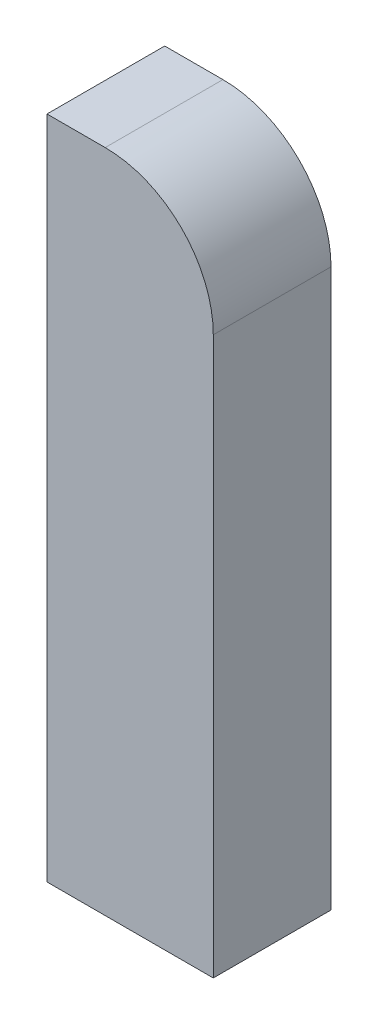
ISO-10303-21;
HEADER;
FILE_DESCRIPTION(('STEP AP214'),'2;1');
FILE_NAME('part.step','',(''),(''),'','','');
FILE_SCHEMA(('AUTOMOTIVE_DESIGN { 1 0 10303 214 1 1 1 1 }'));
ENDSEC;
DATA;
#1=APPLICATION_CONTEXT('core data for automotive mechanical design processes');
#2=APPLICATION_PROTOCOL_DEFINITION('international standard','automotive_design',2000,#1);
#3=PRODUCT_CONTEXT('',#1,'mechanical');
#4=PRODUCT('Part','Part','',(#3));
#5=PRODUCT_RELATED_PRODUCT_CATEGORY('part','',(#4));
#6=PRODUCT_DEFINITION_FORMATION('','',#4);
#7=PRODUCT_DEFINITION_CONTEXT('part definition',#1,'design');
#8=PRODUCT_DEFINITION('design','',#6,#7);
#9=PRODUCT_DEFINITION_SHAPE('','',#8);
#10=(LENGTH_UNIT() NAMED_UNIT(*) SI_UNIT(.MILLI.,.METRE.));
#11=(NAMED_UNIT(*) PLANE_ANGLE_UNIT() SI_UNIT($,.RADIAN.));
#12=(NAMED_UNIT(*) SI_UNIT($,.STERADIAN.) SOLID_ANGLE_UNIT());
#13=UNCERTAINTY_MEASURE_WITH_UNIT(LENGTH_MEASURE(1.E-05),#10,'distance_accuracy_value','');
#14=(GEOMETRIC_REPRESENTATION_CONTEXT(3) GLOBAL_UNCERTAINTY_ASSIGNED_CONTEXT((#13)) GLOBAL_UNIT_ASSIGNED_CONTEXT((#10,
#11,#12)) REPRESENTATION_CONTEXT('',''));
#15=CARTESIAN_POINT('',(0.,0.,0.));
#16=DIRECTION('',(0.,0.,1.));
#17=DIRECTION('',(1.,0.,0.));
#18=AXIS2_PLACEMENT_3D('',#15,#16,#17);
#19=CARTESIAN_POINT('',(0.,0.,17.9832));
#20=DIRECTION('',(1.,0.,0.));
#21=DIRECTION('',(0.,0.,-1.));
#22=AXIS2_PLACEMENT_3D('',#19,#20,#21);
#23=PLANE('',#22);
#24=DIRECTION('',(0.,-1.,0.));
#25=VECTOR('',#24,1.);
#26=CARTESIAN_POINT('',(0.,0.,0.));
#27=LINE('',#26,#25);
#28=CARTESIAN_POINT('',(0.,101.6,0.));
#29=VERTEX_POINT('',#28);
#30=CARTESIAN_POINT('',(0.,0.,0.));
#31=VERTEX_POINT('',#30);
#32=EDGE_CURVE('E103',#29,#31,#27,.T.);
#33=ORIENTED_EDGE('',*,*,#32,.T.);
#34=DIRECTION('',(0.,0.,-1.));
#35=VECTOR('',#34,1.);
#36=CARTESIAN_POINT('',(0.,0.,17.9832));
#37=LINE('',#36,#35);
#38=CARTESIAN_POINT('',(0.,0.,17.9832));
#39=VERTEX_POINT('',#38);
#40=EDGE_CURVE('E85',#39,#31,#37,.T.);
#41=ORIENTED_EDGE('',*,*,#40,.F.);
#42=DIRECTION('',(0.,-1.,0.));
#43=VECTOR('',#42,1.);
#44=CARTESIAN_POINT('',(0.,0.,17.9832));
#45=LINE('',#44,#43);
#46=CARTESIAN_POINT('',(0.,101.6,17.9832));
#47=VERTEX_POINT('',#46);
#48=EDGE_CURVE('E91',#47,#39,#45,.T.);
#49=ORIENTED_EDGE('',*,*,#48,.F.);
#50=DIRECTION('',(0.,0.,-1.));
#51=VECTOR('',#50,1.);
#52=CARTESIAN_POINT('',(0.,101.6,17.9832));
#53=LINE('',#52,#51);
#54=EDGE_CURVE('E109',#47,#29,#53,.T.);
#55=ORIENTED_EDGE('',*,*,#54,.T.);
#56=EDGE_LOOP('',(#33,#41,#49,#55));
#57=FACE_BOUND('',#56,.T.);
#58=ADVANCED_FACE('F34',(#57),#23,.F.);
#59=CARTESIAN_POINT('',(0.,0.,17.9832));
#60=DIRECTION('',(0.,1.,0.));
#61=DIRECTION('',(0.,0.,1.));
#62=AXIS2_PLACEMENT_3D('',#59,#60,#61);
#63=PLANE('',#62);
#64=DIRECTION('',(1.,0.,0.));
#65=VECTOR('',#64,1.);
#66=CARTESIAN_POINT('',(0.,0.,0.));
#67=LINE('',#66,#65);
#68=CARTESIAN_POINT('',(25.4,0.,0.));
#69=VERTEX_POINT('',#68);
#70=EDGE_CURVE('E162',#31,#69,#67,.T.);
#71=ORIENTED_EDGE('',*,*,#70,.T.);
#72=DIRECTION('',(0.,0.,-1.));
#73=VECTOR('',#72,1.);
#74=CARTESIAN_POINT('',(25.4,0.,17.9832));
#75=LINE('',#74,#73);
#76=CARTESIAN_POINT('',(25.4,0.,17.9832));
#77=VERTEX_POINT('',#76);
#78=EDGE_CURVE('E88',#77,#69,#75,.T.);
#79=ORIENTED_EDGE('',*,*,#78,.F.);
#80=DIRECTION('',(1.,0.,0.));
#81=VECTOR('',#80,1.);
#82=CARTESIAN_POINT('',(0.,0.,17.9832));
#83=LINE('',#82,#81);
#84=EDGE_CURVE('E81',#39,#77,#83,.T.);
#85=ORIENTED_EDGE('',*,*,#84,.F.);
#86=ORIENTED_EDGE('',*,*,#40,.T.);
#87=EDGE_LOOP('',(#71,#79,#85,#86));
#88=FACE_BOUND('',#87,.T.);
#89=ADVANCED_FACE('F83',(#88),#63,.F.);
#90=CARTESIAN_POINT('',(25.4,0.,17.9832));
#91=DIRECTION('',(-1.,0.,0.));
#92=DIRECTION('',(0.,-1.,0.));
#93=AXIS2_PLACEMENT_3D('',#90,#91,#92);
#94=PLANE('',#93);
#95=DIRECTION('',(0.,1.,0.));
#96=VECTOR('',#95,1.);
#97=CARTESIAN_POINT('',(25.4,0.,0.));
#98=LINE('',#97,#96);
#99=CARTESIAN_POINT('',(25.4,85.09,0.));
#100=VERTEX_POINT('',#99);
#101=EDGE_CURVE('E159',#69,#100,#98,.T.);
#102=ORIENTED_EDGE('',*,*,#101,.T.);
#103=DIRECTION('',(0.,0.,-1.));
#104=VECTOR('',#103,1.);
#105=CARTESIAN_POINT('',(25.4,85.09,17.9832));
#106=LINE('',#105,#104);
#107=CARTESIAN_POINT('',(25.4,85.09,17.9832));
#108=VERTEX_POINT('',#107);
#109=EDGE_CURVE('E42',#100,#108,#106,.F.);
#110=ORIENTED_EDGE('',*,*,#109,.T.);
#111=DIRECTION('',(0.,1.,0.));
#112=VECTOR('',#111,1.);
#113=CARTESIAN_POINT('',(25.4,0.,17.9832));
#114=LINE('',#113,#112);
#115=EDGE_CURVE('E90',#77,#108,#114,.T.);
#116=ORIENTED_EDGE('',*,*,#115,.F.);
#117=ORIENTED_EDGE('',*,*,#78,.T.);
#118=EDGE_LOOP('',(#102,#110,#116,#117));
#119=FACE_BOUND('',#118,.T.);
#120=ADVANCED_FACE('F141',(#119),#94,.F.);
#121=CARTESIAN_POINT('',(0.,101.6,17.9832));
#122=DIRECTION('',(0.,-1.,0.));
#123=DIRECTION('',(0.,0.,-1.));
#124=AXIS2_PLACEMENT_3D('',#121,#122,#123);
#125=PLANE('',#124);
#126=DIRECTION('',(-1.,0.,0.));
#127=VECTOR('',#126,1.);
#128=CARTESIAN_POINT('',(0.,101.6,17.9832));
#129=LINE('',#128,#127);
#130=CARTESIAN_POINT('',(8.88999999999998,101.6,17.9832));
#131=VERTEX_POINT('',#130);
#132=EDGE_CURVE('E96',#131,#47,#129,.T.);
#133=ORIENTED_EDGE('',*,*,#132,.F.);
#134=DIRECTION('',(0.,0.,-1.));
#135=VECTOR('',#134,1.);
#136=CARTESIAN_POINT('',(8.88999999999998,101.6,17.9832));
#137=LINE('',#136,#135);
#138=CARTESIAN_POINT('',(8.88999999999998,101.6,0.));
#139=VERTEX_POINT('',#138);
#140=EDGE_CURVE('E104',#131,#139,#137,.T.);
#141=ORIENTED_EDGE('',*,*,#140,.T.);
#142=DIRECTION('',(-1.,0.,0.));
#143=VECTOR('',#142,1.);
#144=CARTESIAN_POINT('',(0.,101.6,0.));
#145=LINE('',#144,#143);
#146=EDGE_CURVE('E100',#139,#29,#145,.T.);
#147=ORIENTED_EDGE('',*,*,#146,.T.);
#148=ORIENTED_EDGE('',*,*,#54,.F.);
#149=EDGE_LOOP('',(#133,#141,#147,#148));
#150=FACE_BOUND('',#149,.T.);
#151=ADVANCED_FACE('F130',(#150),#125,.F.);
#152=CARTESIAN_POINT('',(0.,0.,17.9832));
#153=DIRECTION('',(0.,0.,-1.));
#154=DIRECTION('',(-1.,0.,0.));
#155=AXIS2_PLACEMENT_3D('',#152,#153,#154);
#156=PLANE('',#155);
#157=ORIENTED_EDGE('',*,*,#115,.T.);
#158=CARTESIAN_POINT('',(8.88999999999998,85.09,17.9832));
#159=DIRECTION('',(0.,0.,-1.));
#160=DIRECTION('',(-1.,0.,0.));
#161=AXIS2_PLACEMENT_3D('',#158,#159,#160);
#162=CIRCLE('',#161,16.51);
#163=EDGE_CURVE('E11',#108,#131,#162,.F.);
#164=ORIENTED_EDGE('',*,*,#163,.T.);
#165=ORIENTED_EDGE('',*,*,#132,.T.);
#166=ORIENTED_EDGE('',*,*,#48,.T.);
#167=ORIENTED_EDGE('',*,*,#84,.T.);
#168=EDGE_LOOP('',(#157,#164,#165,#166,#167));
#169=FACE_BOUND('',#168,.T.);
#170=ADVANCED_FACE('F94',(#169),#156,.F.);
#171=CARTESIAN_POINT('',(0.,0.,0.));
#172=DIRECTION('',(0.,0.,-1.));
#173=DIRECTION('',(-1.,0.,0.));
#174=AXIS2_PLACEMENT_3D('',#171,#172,#173);
#175=PLANE('',#174);
#176=ORIENTED_EDGE('',*,*,#146,.F.);
#177=CARTESIAN_POINT('',(8.88999999999998,85.09,0.));
#178=DIRECTION('',(0.,0.,-1.));
#179=DIRECTION('',(-1.,0.,0.));
#180=AXIS2_PLACEMENT_3D('',#177,#178,#179);
#181=CIRCLE('',#180,16.51);
#182=EDGE_CURVE('E56',#139,#100,#181,.T.);
#183=ORIENTED_EDGE('',*,*,#182,.T.);
#184=ORIENTED_EDGE('',*,*,#101,.F.);
#185=ORIENTED_EDGE('',*,*,#70,.F.);
#186=ORIENTED_EDGE('',*,*,#32,.F.);
#187=EDGE_LOOP('',(#176,#183,#184,#185,#186));
#188=FACE_BOUND('',#187,.T.);
#189=ADVANCED_FACE('F129',(#188),#175,.T.);
#190=CARTESIAN_POINT('',(8.88999999999998,85.09,17.9832));
#191=DIRECTION('',(0.,0.,-1.));
#192=DIRECTION('',(-1.,0.,0.));
#193=AXIS2_PLACEMENT_3D('',#190,#191,#192);
#194=CYLINDRICAL_SURFACE('',#193,16.51);
#195=ORIENTED_EDGE('',*,*,#163,.F.);
#196=ORIENTED_EDGE('',*,*,#109,.F.);
#197=ORIENTED_EDGE('',*,*,#182,.F.);
#198=ORIENTED_EDGE('',*,*,#140,.F.);
#199=EDGE_LOOP('',(#195,#196,#197,#198));
#200=FACE_BOUND('',#199,.T.);
#201=ADVANCED_FACE('F36',(#200),#194,.T.);
#202=CLOSED_SHELL('',(#58,#89,#120,#151,#170,#189,#201));
#203=MANIFOLD_SOLID_BREP('B2',#202);
#204=ADVANCED_BREP_SHAPE_REPRESENTATION('',(#18,#203),#14);
#205=SHAPE_DEFINITION_REPRESENTATION(#9,#204);
ENDSEC;
END-ISO-10303-21;
